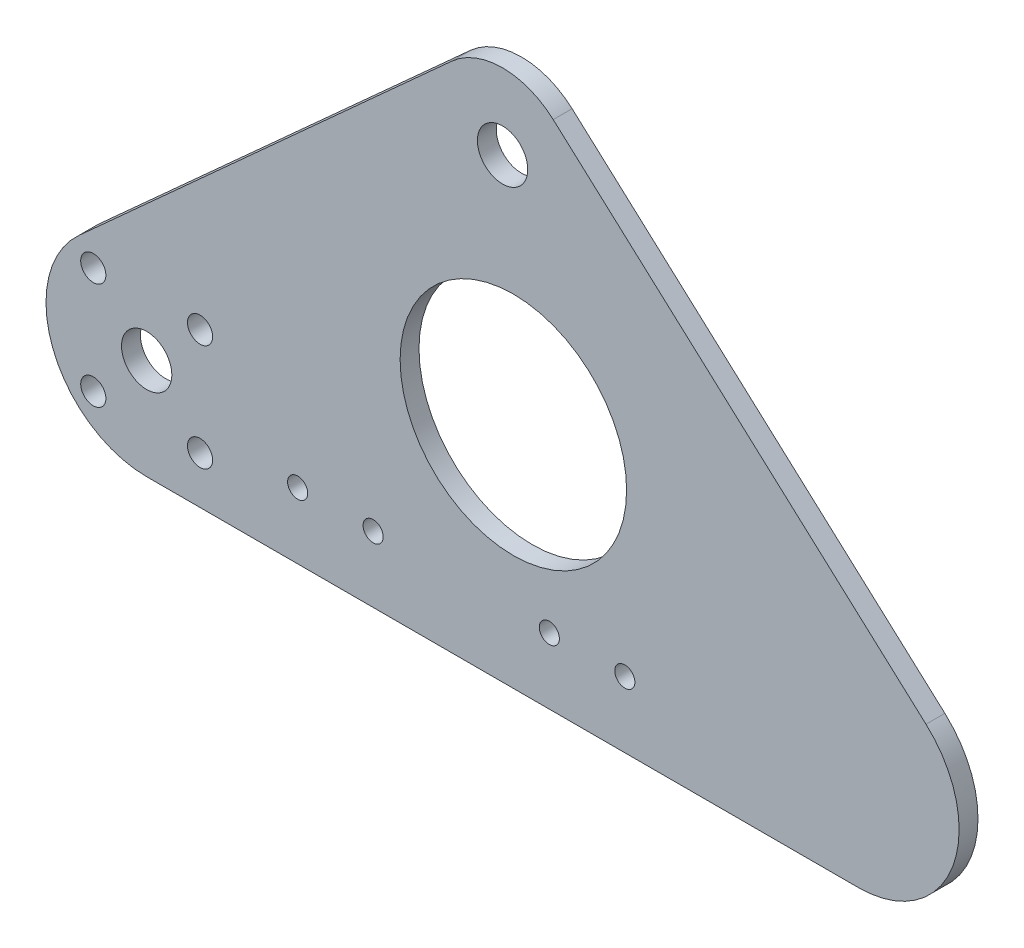
ISO-10303-21;
HEADER;
FILE_DESCRIPTION(('STEP AP214'),'2;1');
FILE_NAME('part.step','',(''),(''),'','','');
FILE_SCHEMA(('AUTOMOTIVE_DESIGN { 1 0 10303 214 1 1 1 1 }'));
ENDSEC;
DATA;
#1=APPLICATION_CONTEXT('core data for automotive mechanical design processes');
#2=APPLICATION_PROTOCOL_DEFINITION('international standard','automotive_design',2000,#1);
#3=PRODUCT_CONTEXT('',#1,'mechanical');
#4=PRODUCT('Part','Part','',(#3));
#5=PRODUCT_RELATED_PRODUCT_CATEGORY('part','',(#4));
#6=PRODUCT_DEFINITION_FORMATION('','',#4);
#7=PRODUCT_DEFINITION_CONTEXT('part definition',#1,'design');
#8=PRODUCT_DEFINITION('design','',#6,#7);
#9=PRODUCT_DEFINITION_SHAPE('','',#8);
#10=(LENGTH_UNIT() NAMED_UNIT(*) SI_UNIT(.MILLI.,.METRE.));
#11=(NAMED_UNIT(*) PLANE_ANGLE_UNIT() SI_UNIT($,.RADIAN.));
#12=(NAMED_UNIT(*) SI_UNIT($,.STERADIAN.) SOLID_ANGLE_UNIT());
#13=UNCERTAINTY_MEASURE_WITH_UNIT(LENGTH_MEASURE(1.E-05),#10,'distance_accuracy_value','');
#14=(GEOMETRIC_REPRESENTATION_CONTEXT(3) GLOBAL_UNCERTAINTY_ASSIGNED_CONTEXT((#13)) GLOBAL_UNIT_ASSIGNED_CONTEXT((#10,
#11,#12)) REPRESENTATION_CONTEXT('',''));
#15=CARTESIAN_POINT('',(0.,0.,0.));
#16=DIRECTION('',(0.,0.,1.));
#17=DIRECTION('',(1.,0.,0.));
#18=AXIS2_PLACEMENT_3D('',#15,#16,#17);
#19=CARTESIAN_POINT('',(-1.71572875252801,36.2842712474748,3.));
#20=DIRECTION('',(0.,0.,1.));
#21=DIRECTION('',(1.,0.,0.));
#22=AXIS2_PLACEMENT_3D('',#19,#20,#21);
#23=PLANE('',#22);
#24=CARTESIAN_POINT('',(-49.7989898732797,-28.7695526217209,3.));
#25=DIRECTION('',(0.,0.,1.));
#26=DIRECTION('',(1.,0.,0.));
#27=AXIS2_PLACEMENT_3D('',#24,#25,#26);
#28=CIRCLE('',#27,2.);
#29=CARTESIAN_POINT('',(-47.7989898732797,-28.7695526217209,3.));
#30=VERTEX_POINT('',#29);
#31=EDGE_CURVE('E217',#30,#30,#28,.T.);
#32=ORIENTED_EDGE('',*,*,#31,.F.);
#33=EDGE_LOOP('',(#32));
#34=FACE_BOUND('',#33,.T.);
#35=CARTESIAN_POINT('',(-66.7695526217568,-11.7989898732438,3.));
#36=DIRECTION('',(0.,0.,1.));
#37=DIRECTION('',(1.,0.,0.));
#38=AXIS2_PLACEMENT_3D('',#35,#36,#37);
#39=CIRCLE('',#38,2.);
#40=CARTESIAN_POINT('',(-64.7695526217568,-11.7989898732438,3.));
#41=VERTEX_POINT('',#40);
#42=EDGE_CURVE('E229',#41,#41,#39,.T.);
#43=ORIENTED_EDGE('',*,*,#42,.F.);
#44=EDGE_LOOP('',(#43));
#45=FACE_BOUND('',#44,.T.);
#46=CARTESIAN_POINT('',(-34.284271247472,-25.784271247471,3.));
#47=DIRECTION('',(0.,0.,1.));
#48=DIRECTION('',(1.,0.,0.));
#49=AXIS2_PLACEMENT_3D('',#46,#47,#48);
#50=CIRCLE('',#49,1.59999999999982);
#51=CARTESIAN_POINT('',(-32.6842712474722,-25.784271247471,3.));
#52=VERTEX_POINT('',#51);
#53=EDGE_CURVE('E241',#52,#52,#50,.T.);
#54=ORIENTED_EDGE('',*,*,#53,.F.);
#55=EDGE_LOOP('',(#54));
#56=FACE_BOUND('',#55,.T.);
#57=CARTESIAN_POINT('',(-1.71572875252801,36.2842712474748,3.));
#58=DIRECTION('',(0.,0.,1.));
#59=DIRECTION('',(1.,0.,0.));
#60=AXIS2_PLACEMENT_3D('',#57,#58,#59);
#61=CIRCLE('',#60,4.);
#62=CARTESIAN_POINT('',(2.28427124747199,36.2842712474748,3.));
#63=VERTEX_POINT('',#62);
#64=EDGE_CURVE('E253',#63,#63,#61,.T.);
#65=ORIENTED_EDGE('',*,*,#64,.F.);
#66=EDGE_LOOP('',(#65));
#67=FACE_BOUND('',#66,.T.);
#68=CARTESIAN_POINT('',(0.,0.,3.));
#69=DIRECTION('',(0.,0.,1.));
#70=DIRECTION('',(1.,0.,0.));
#71=AXIS2_PLACEMENT_3D('',#68,#69,#70);
#72=CIRCLE('',#71,17.9999999999998);
#73=CARTESIAN_POINT('',(17.9999999999998,0.,3.));
#74=VERTEX_POINT('',#73);
#75=EDGE_CURVE('E265',#74,#74,#72,.T.);
#76=ORIENTED_EDGE('',*,*,#75,.F.);
#77=EDGE_LOOP('',(#76));
#78=FACE_BOUND('',#77,.T.);
#79=CARTESIAN_POINT('',(-1.71572875252801,36.2842712474748,3.));
#80=DIRECTION('',(0.,0.,1.));
#81=DIRECTION('',(1.,0.,0.));
#82=AXIS2_PLACEMENT_3D('',#79,#80,#81);
#83=CIRCLE('',#82,12.0000000000314);
#84=CARTESIAN_POINT('',(6.33467531394946,45.1832034512389,3.));
#85=VERTEX_POINT('',#84);
#86=CARTESIAN_POINT('',(-9.7661328189389,45.1832034512999,3.));
#87=VERTEX_POINT('',#86);
#88=EDGE_CURVE('E129',#85,#87,#83,.T.);
#89=ORIENTED_EDGE('',*,*,#88,.T.);
#90=DIRECTION('',(-0.741577683650602,-0.670867005531952,0.));
#91=VECTOR('',#90,1.);
#92=CARTESIAN_POINT('',(-69.0181433359904,-8.41902830902175,3.));
#93=LINE('',#92,#91);
#94=CARTESIAN_POINT('',(-69.01814333599,-8.41902830902226,3.));
#95=VERTEX_POINT('',#94);
#96=EDGE_CURVE('E87',#87,#95,#93,.T.);
#97=ORIENTED_EDGE('',*,*,#96,.T.);
#98=CARTESIAN_POINT('',(-58.2842712475178,-20.2842712474828,3.));
#99=DIRECTION('',(0.,0.,1.));
#100=DIRECTION('',(1.,0.,0.));
#101=AXIS2_PLACEMENT_3D('',#98,#99,#100);
#102=CIRCLE('',#101,16.0000000000116);
#103=CARTESIAN_POINT('',(-58.2842712473575,-36.2842712474937,3.));
#104=VERTEX_POINT('',#103);
#105=EDGE_CURVE('E100',#95,#104,#102,.T.);
#106=ORIENTED_EDGE('',*,*,#105,.T.);
#107=DIRECTION('',(1.,0.,0.));
#108=VECTOR('',#107,1.);
#109=CARTESIAN_POINT('',(-58.2842712473575,-36.2842712474937,3.));
#110=LINE('',#109,#108);
#111=CARTESIAN_POINT('',(54.8528137424922,-36.284271247494,3.));
#112=VERTEX_POINT('',#111);
#113=EDGE_CURVE('E94',#104,#112,#110,.T.);
#114=ORIENTED_EDGE('',*,*,#113,.T.);
#115=CARTESIAN_POINT('',(54.8528137424931,-20.2842712474936,3.));
#116=DIRECTION('',(0.,0.,1.));
#117=DIRECTION('',(1.,0.,0.));
#118=AXIS2_PLACEMENT_3D('',#115,#116,#117);
#119=CIRCLE('',#118,16.0000000000004);
#120=CARTESIAN_POINT('',(65.586685831003,-8.41902830908191,3.));
#121=VERTEX_POINT('',#120);
#122=EDGE_CURVE('E98',#112,#121,#119,.T.);
#123=ORIENTED_EDGE('',*,*,#122,.T.);
#124=DIRECTION('',(-0.741577683650618,0.670867005531934,0.));
#125=VECTOR('',#124,1.);
#126=CARTESIAN_POINT('',(65.586685831003,-8.41902830908191,3.));
#127=LINE('',#126,#125);
#128=EDGE_CURVE('E50',#121,#85,#127,.T.);
#129=ORIENTED_EDGE('',*,*,#128,.T.);
#130=EDGE_LOOP('',(#89,#97,#106,#114,#123,#129));
#131=FACE_BOUND('',#130,.T.);
#132=CARTESIAN_POINT('',(5.71572875252802,-25.7842712474719,3.));
#133=DIRECTION('',(0.,0.,1.));
#134=DIRECTION('',(1.,0.,0.));
#135=AXIS2_PLACEMENT_3D('',#132,#133,#134);
#136=CIRCLE('',#135,1.59999999999982);
#137=CARTESIAN_POINT('',(7.31572875252784,-25.7842712474719,3.));
#138=VERTEX_POINT('',#137);
#139=EDGE_CURVE('E122',#138,#138,#136,.T.);
#140=ORIENTED_EDGE('',*,*,#139,.F.);
#141=EDGE_LOOP('',(#140));
#142=FACE_BOUND('',#141,.T.);
#143=CARTESIAN_POINT('',(-58.2842712475178,-20.2842712474828,3.));
#144=DIRECTION('',(0.,0.,1.));
#145=DIRECTION('',(1.,0.,0.));
#146=AXIS2_PLACEMENT_3D('',#143,#144,#145);
#147=CIRCLE('',#146,3.9999999999738);
#148=CARTESIAN_POINT('',(-54.284271247544,-20.2842712474828,3.));
#149=VERTEX_POINT('',#148);
#150=EDGE_CURVE('E259',#149,#149,#147,.T.);
#151=ORIENTED_EDGE('',*,*,#150,.F.);
#152=EDGE_LOOP('',(#151));
#153=FACE_BOUND('',#152,.T.);
#154=CARTESIAN_POINT('',(-22.2842712474725,-25.7842712474701,3.));
#155=DIRECTION('',(0.,0.,1.));
#156=DIRECTION('',(1.,0.,0.));
#157=AXIS2_PLACEMENT_3D('',#154,#155,#156);
#158=CIRCLE('',#157,1.60000000000027);
#159=CARTESIAN_POINT('',(-20.6842712474722,-25.7842712474701,3.));
#160=VERTEX_POINT('',#159);
#161=EDGE_CURVE('E247',#160,#160,#158,.T.);
#162=ORIENTED_EDGE('',*,*,#161,.F.);
#163=EDGE_LOOP('',(#162));
#164=FACE_BOUND('',#163,.T.);
#165=CARTESIAN_POINT('',(17.7157287525276,-25.7842712474701,3.));
#166=DIRECTION('',(0.,0.,1.));
#167=DIRECTION('',(1.,0.,0.));
#168=AXIS2_PLACEMENT_3D('',#165,#166,#167);
#169=CIRCLE('',#168,1.60000000000027);
#170=CARTESIAN_POINT('',(19.3157287525278,-25.7842712474701,3.));
#171=VERTEX_POINT('',#170);
#172=EDGE_CURVE('E235',#171,#171,#169,.T.);
#173=ORIENTED_EDGE('',*,*,#172,.F.);
#174=EDGE_LOOP('',(#173));
#175=FACE_BOUND('',#174,.T.);
#176=CARTESIAN_POINT('',(-49.7989898732792,-11.7989898732442,3.));
#177=DIRECTION('',(0.,0.,1.));
#178=DIRECTION('',(1.,0.,0.));
#179=AXIS2_PLACEMENT_3D('',#176,#177,#178);
#180=CIRCLE('',#179,2.);
#181=CARTESIAN_POINT('',(-47.7989898732792,-11.7989898732442,3.));
#182=VERTEX_POINT('',#181);
#183=EDGE_CURVE('E223',#182,#182,#180,.T.);
#184=ORIENTED_EDGE('',*,*,#183,.F.);
#185=EDGE_LOOP('',(#184));
#186=FACE_BOUND('',#185,.T.);
#187=CARTESIAN_POINT('',(-66.7695526217564,-28.7695526217213,3.));
#188=DIRECTION('',(0.,0.,1.));
#189=DIRECTION('',(1.,0.,0.));
#190=AXIS2_PLACEMENT_3D('',#187,#188,#189);
#191=CIRCLE('',#190,2.);
#192=CARTESIAN_POINT('',(-64.7695526217564,-28.7695526217213,3.));
#193=VERTEX_POINT('',#192);
#194=EDGE_CURVE('E208',#193,#193,#191,.T.);
#195=ORIENTED_EDGE('',*,*,#194,.F.);
#196=EDGE_LOOP('',(#195));
#197=FACE_BOUND('',#196,.T.);
#198=ADVANCED_FACE('F33',(#34,#45,#56,#67,#78,#131,#142,#153,#164,#175,#186,#197),#23,.T.);
#199=CARTESIAN_POINT('',(-1.71572875252801,36.2842712474748,0.));
#200=DIRECTION('',(0.,0.,1.));
#201=DIRECTION('',(1.,0.,0.));
#202=AXIS2_PLACEMENT_3D('',#199,#200,#201);
#203=PLANE('',#202);
#204=CARTESIAN_POINT('',(-1.71572875252801,36.2842712474748,0.));
#205=DIRECTION('',(0.,0.,1.));
#206=DIRECTION('',(1.,0.,0.));
#207=AXIS2_PLACEMENT_3D('',#204,#205,#206);
#208=CIRCLE('',#207,12.0000000000314);
#209=CARTESIAN_POINT('',(6.33467531394946,45.1832034512389,0.));
#210=VERTEX_POINT('',#209);
#211=CARTESIAN_POINT('',(-9.7661328189389,45.1832034512999,0.));
#212=VERTEX_POINT('',#211);
#213=EDGE_CURVE('E118',#210,#212,#208,.T.);
#214=ORIENTED_EDGE('',*,*,#213,.F.);
#215=DIRECTION('',(-0.741577683650618,0.670867005531934,0.));
#216=VECTOR('',#215,1.);
#217=CARTESIAN_POINT('',(65.586685831003,-8.41902830908191,0.));
#218=LINE('',#217,#216);
#219=CARTESIAN_POINT('',(65.586685831003,-8.41902830908191,0.));
#220=VERTEX_POINT('',#219);
#221=EDGE_CURVE('E79',#220,#210,#218,.T.);
#222=ORIENTED_EDGE('',*,*,#221,.F.);
#223=CARTESIAN_POINT('',(54.8528137424931,-20.2842712474936,0.));
#224=DIRECTION('',(0.,0.,1.));
#225=DIRECTION('',(1.,0.,0.));
#226=AXIS2_PLACEMENT_3D('',#223,#224,#225);
#227=CIRCLE('',#226,16.0000000000004);
#228=CARTESIAN_POINT('',(54.8528137424922,-36.284271247494,0.));
#229=VERTEX_POINT('',#228);
#230=EDGE_CURVE('E73',#229,#220,#227,.T.);
#231=ORIENTED_EDGE('',*,*,#230,.F.);
#232=DIRECTION('',(1.,0.,0.));
#233=VECTOR('',#232,1.);
#234=CARTESIAN_POINT('',(-58.2842712473575,-36.2842712474937,0.));
#235=LINE('',#234,#233);
#236=CARTESIAN_POINT('',(-58.2842712473575,-36.2842712474937,0.));
#237=VERTEX_POINT('',#236);
#238=EDGE_CURVE('E108',#237,#229,#235,.T.);
#239=ORIENTED_EDGE('',*,*,#238,.F.);
#240=CARTESIAN_POINT('',(-58.2842712475178,-20.2842712474828,0.));
#241=DIRECTION('',(0.,0.,1.));
#242=DIRECTION('',(1.,0.,0.));
#243=AXIS2_PLACEMENT_3D('',#240,#241,#242);
#244=CIRCLE('',#243,16.0000000000116);
#245=CARTESIAN_POINT('',(-69.01814333599,-8.41902830902226,0.));
#246=VERTEX_POINT('',#245);
#247=EDGE_CURVE('E124',#246,#237,#244,.T.);
#248=ORIENTED_EDGE('',*,*,#247,.F.);
#249=DIRECTION('',(-0.741577683650602,-0.670867005531952,0.));
#250=VECTOR('',#249,1.);
#251=CARTESIAN_POINT('',(-69.0181433359904,-8.41902830902175,0.));
#252=LINE('',#251,#250);
#253=EDGE_CURVE('E121',#212,#246,#252,.T.);
#254=ORIENTED_EDGE('',*,*,#253,.F.);
#255=EDGE_LOOP('',(#214,#222,#231,#239,#248,#254));
#256=FACE_BOUND('',#255,.T.);
#257=CARTESIAN_POINT('',(5.71572875252802,-25.7842712474719,0.));
#258=DIRECTION('',(0.,0.,1.));
#259=DIRECTION('',(1.,0.,0.));
#260=AXIS2_PLACEMENT_3D('',#257,#258,#259);
#261=CIRCLE('',#260,1.59999999999982);
#262=CARTESIAN_POINT('',(7.31572875252784,-25.7842712474719,0.));
#263=VERTEX_POINT('',#262);
#264=EDGE_CURVE('E268',#263,#263,#261,.T.);
#265=ORIENTED_EDGE('',*,*,#264,.T.);
#266=EDGE_LOOP('',(#265));
#267=FACE_BOUND('',#266,.T.);
#268=CARTESIAN_POINT('',(0.,0.,0.));
#269=DIRECTION('',(0.,0.,1.));
#270=DIRECTION('',(1.,0.,0.));
#271=AXIS2_PLACEMENT_3D('',#268,#269,#270);
#272=CIRCLE('',#271,17.9999999999998);
#273=CARTESIAN_POINT('',(17.9999999999998,0.,0.));
#274=VERTEX_POINT('',#273);
#275=EDGE_CURVE('E262',#274,#274,#272,.T.);
#276=ORIENTED_EDGE('',*,*,#275,.T.);
#277=EDGE_LOOP('',(#276));
#278=FACE_BOUND('',#277,.T.);
#279=CARTESIAN_POINT('',(-58.2842712475178,-20.2842712474828,0.));
#280=DIRECTION('',(0.,0.,1.));
#281=DIRECTION('',(1.,0.,0.));
#282=AXIS2_PLACEMENT_3D('',#279,#280,#281);
#283=CIRCLE('',#282,3.9999999999738);
#284=CARTESIAN_POINT('',(-54.284271247544,-20.2842712474828,0.));
#285=VERTEX_POINT('',#284);
#286=EDGE_CURVE('E256',#285,#285,#283,.T.);
#287=ORIENTED_EDGE('',*,*,#286,.T.);
#288=EDGE_LOOP('',(#287));
#289=FACE_BOUND('',#288,.T.);
#290=CARTESIAN_POINT('',(-1.71572875252801,36.2842712474748,0.));
#291=DIRECTION('',(0.,0.,1.));
#292=DIRECTION('',(1.,0.,0.));
#293=AXIS2_PLACEMENT_3D('',#290,#291,#292);
#294=CIRCLE('',#293,4.);
#295=CARTESIAN_POINT('',(2.28427124747199,36.2842712474748,0.));
#296=VERTEX_POINT('',#295);
#297=EDGE_CURVE('E250',#296,#296,#294,.T.);
#298=ORIENTED_EDGE('',*,*,#297,.T.);
#299=EDGE_LOOP('',(#298));
#300=FACE_BOUND('',#299,.T.);
#301=CARTESIAN_POINT('',(-22.2842712474725,-25.7842712474701,0.));
#302=DIRECTION('',(0.,0.,1.));
#303=DIRECTION('',(1.,0.,0.));
#304=AXIS2_PLACEMENT_3D('',#301,#302,#303);
#305=CIRCLE('',#304,1.60000000000027);
#306=CARTESIAN_POINT('',(-20.6842712474722,-25.7842712474701,0.));
#307=VERTEX_POINT('',#306);
#308=EDGE_CURVE('E244',#307,#307,#305,.T.);
#309=ORIENTED_EDGE('',*,*,#308,.T.);
#310=EDGE_LOOP('',(#309));
#311=FACE_BOUND('',#310,.T.);
#312=CARTESIAN_POINT('',(-34.284271247472,-25.784271247471,0.));
#313=DIRECTION('',(0.,0.,1.));
#314=DIRECTION('',(1.,0.,0.));
#315=AXIS2_PLACEMENT_3D('',#312,#313,#314);
#316=CIRCLE('',#315,1.59999999999982);
#317=CARTESIAN_POINT('',(-32.6842712474722,-25.784271247471,0.));
#318=VERTEX_POINT('',#317);
#319=EDGE_CURVE('E238',#318,#318,#316,.T.);
#320=ORIENTED_EDGE('',*,*,#319,.T.);
#321=EDGE_LOOP('',(#320));
#322=FACE_BOUND('',#321,.T.);
#323=CARTESIAN_POINT('',(17.7157287525276,-25.7842712474701,0.));
#324=DIRECTION('',(0.,0.,1.));
#325=DIRECTION('',(1.,0.,0.));
#326=AXIS2_PLACEMENT_3D('',#323,#324,#325);
#327=CIRCLE('',#326,1.60000000000027);
#328=CARTESIAN_POINT('',(19.3157287525278,-25.7842712474701,0.));
#329=VERTEX_POINT('',#328);
#330=EDGE_CURVE('E232',#329,#329,#327,.T.);
#331=ORIENTED_EDGE('',*,*,#330,.T.);
#332=EDGE_LOOP('',(#331));
#333=FACE_BOUND('',#332,.T.);
#334=CARTESIAN_POINT('',(-66.7695526217568,-11.7989898732438,0.));
#335=DIRECTION('',(0.,0.,1.));
#336=DIRECTION('',(1.,0.,0.));
#337=AXIS2_PLACEMENT_3D('',#334,#335,#336);
#338=CIRCLE('',#337,2.);
#339=CARTESIAN_POINT('',(-64.7695526217568,-11.7989898732438,0.));
#340=VERTEX_POINT('',#339);
#341=EDGE_CURVE('E226',#340,#340,#338,.T.);
#342=ORIENTED_EDGE('',*,*,#341,.T.);
#343=EDGE_LOOP('',(#342));
#344=FACE_BOUND('',#343,.T.);
#345=CARTESIAN_POINT('',(-49.7989898732792,-11.7989898732442,0.));
#346=DIRECTION('',(0.,0.,1.));
#347=DIRECTION('',(1.,0.,0.));
#348=AXIS2_PLACEMENT_3D('',#345,#346,#347);
#349=CIRCLE('',#348,2.);
#350=CARTESIAN_POINT('',(-47.7989898732792,-11.7989898732442,0.));
#351=VERTEX_POINT('',#350);
#352=EDGE_CURVE('E220',#351,#351,#349,.T.);
#353=ORIENTED_EDGE('',*,*,#352,.T.);
#354=EDGE_LOOP('',(#353));
#355=FACE_BOUND('',#354,.T.);
#356=CARTESIAN_POINT('',(-49.7989898732797,-28.7695526217209,0.));
#357=DIRECTION('',(0.,0.,1.));
#358=DIRECTION('',(1.,0.,0.));
#359=AXIS2_PLACEMENT_3D('',#356,#357,#358);
#360=CIRCLE('',#359,2.);
#361=CARTESIAN_POINT('',(-47.7989898732797,-28.7695526217209,0.));
#362=VERTEX_POINT('',#361);
#363=EDGE_CURVE('E214',#362,#362,#360,.T.);
#364=ORIENTED_EDGE('',*,*,#363,.T.);
#365=EDGE_LOOP('',(#364));
#366=FACE_BOUND('',#365,.T.);
#367=CARTESIAN_POINT('',(-66.7695526217564,-28.7695526217213,0.));
#368=DIRECTION('',(0.,0.,1.));
#369=DIRECTION('',(1.,0.,0.));
#370=AXIS2_PLACEMENT_3D('',#367,#368,#369);
#371=CIRCLE('',#370,2.);
#372=CARTESIAN_POINT('',(-64.7695526217564,-28.7695526217213,0.));
#373=VERTEX_POINT('',#372);
#374=EDGE_CURVE('E211',#373,#373,#371,.T.);
#375=ORIENTED_EDGE('',*,*,#374,.T.);
#376=EDGE_LOOP('',(#375));
#377=FACE_BOUND('',#376,.T.);
#378=ADVANCED_FACE('F138',(#256,#267,#278,#289,#300,#311,#322,#333,#344,#355,#366,#377),#203,.F.);
#379=CARTESIAN_POINT('',(-1.71572875252801,36.2842712474748,3.));
#380=DIRECTION('',(0.,0.,-1.));
#381=DIRECTION('',(-1.,0.,0.));
#382=AXIS2_PLACEMENT_3D('',#379,#380,#381);
#383=CYLINDRICAL_SURFACE('',#382,12.0000000000314);
#384=ORIENTED_EDGE('',*,*,#213,.T.);
#385=DIRECTION('',(0.,0.,-1.));
#386=VECTOR('',#385,1.);
#387=CARTESIAN_POINT('',(-9.7661328189389,45.1832034512999,3.));
#388=LINE('',#387,#386);
#389=EDGE_CURVE('E11',#87,#212,#388,.T.);
#390=ORIENTED_EDGE('',*,*,#389,.F.);
#391=ORIENTED_EDGE('',*,*,#88,.F.);
#392=DIRECTION('',(0.,0.,-1.));
#393=VECTOR('',#392,1.);
#394=CARTESIAN_POINT('',(6.33467531394946,45.1832034512389,3.));
#395=LINE('',#394,#393);
#396=EDGE_CURVE('E114',#85,#210,#395,.T.);
#397=ORIENTED_EDGE('',*,*,#396,.T.);
#398=EDGE_LOOP('',(#384,#390,#391,#397));
#399=FACE_BOUND('',#398,.T.);
#400=ADVANCED_FACE('F35',(#399),#383,.T.);
#401=CARTESIAN_POINT('',(-69.0181433359904,-8.41902830902175,3.));
#402=DIRECTION('',(0.670867005531952,-0.741577683650602,0.));
#403=DIRECTION('',(0.741577683650602,0.670867005531952,0.));
#404=AXIS2_PLACEMENT_3D('',#401,#402,#403);
#405=PLANE('',#404);
#406=ORIENTED_EDGE('',*,*,#253,.T.);
#407=DIRECTION('',(0.,0.,-1.));
#408=VECTOR('',#407,1.);
#409=CARTESIAN_POINT('',(-69.01814333599,-8.41902830902226,3.));
#410=LINE('',#409,#408);
#411=EDGE_CURVE('E42',#95,#246,#410,.T.);
#412=ORIENTED_EDGE('',*,*,#411,.F.);
#413=ORIENTED_EDGE('',*,*,#96,.F.);
#414=ORIENTED_EDGE('',*,*,#389,.T.);
#415=EDGE_LOOP('',(#406,#412,#413,#414));
#416=FACE_BOUND('',#415,.T.);
#417=ADVANCED_FACE('F389',(#416),#405,.F.);
#418=CARTESIAN_POINT('',(-58.2842712475178,-20.2842712474828,3.));
#419=DIRECTION('',(0.,0.,-1.));
#420=DIRECTION('',(-1.,0.,0.));
#421=AXIS2_PLACEMENT_3D('',#418,#419,#420);
#422=CYLINDRICAL_SURFACE('',#421,16.0000000000116);
#423=ORIENTED_EDGE('',*,*,#247,.T.);
#424=DIRECTION('',(0.,0.,-1.));
#425=VECTOR('',#424,1.);
#426=CARTESIAN_POINT('',(-58.2842712473575,-36.2842712474937,3.));
#427=LINE('',#426,#425);
#428=EDGE_CURVE('E109',#104,#237,#427,.T.);
#429=ORIENTED_EDGE('',*,*,#428,.F.);
#430=ORIENTED_EDGE('',*,*,#105,.F.);
#431=ORIENTED_EDGE('',*,*,#411,.T.);
#432=EDGE_LOOP('',(#423,#429,#430,#431));
#433=FACE_BOUND('',#432,.T.);
#434=ADVANCED_FACE('F135',(#433),#422,.T.);
#435=CARTESIAN_POINT('',(-58.2842712473575,-36.2842712474937,3.));
#436=DIRECTION('',(0.,1.,0.));
#437=DIRECTION('',(0.,0.,1.));
#438=AXIS2_PLACEMENT_3D('',#435,#436,#437);
#439=PLANE('',#438);
#440=ORIENTED_EDGE('',*,*,#238,.T.);
#441=DIRECTION('',(0.,0.,-1.));
#442=VECTOR('',#441,1.);
#443=CARTESIAN_POINT('',(54.8528137424922,-36.284271247494,3.));
#444=LINE('',#443,#442);
#445=EDGE_CURVE('E105',#112,#229,#444,.T.);
#446=ORIENTED_EDGE('',*,*,#445,.F.);
#447=ORIENTED_EDGE('',*,*,#113,.F.);
#448=ORIENTED_EDGE('',*,*,#428,.T.);
#449=EDGE_LOOP('',(#440,#446,#447,#448));
#450=FACE_BOUND('',#449,.T.);
#451=ADVANCED_FACE('F106',(#450),#439,.F.);
#452=CARTESIAN_POINT('',(54.8528137424931,-20.2842712474936,3.));
#453=DIRECTION('',(0.,0.,-1.));
#454=DIRECTION('',(-1.,0.,0.));
#455=AXIS2_PLACEMENT_3D('',#452,#453,#454);
#456=CYLINDRICAL_SURFACE('',#455,16.0000000000004);
#457=ORIENTED_EDGE('',*,*,#230,.T.);
#458=DIRECTION('',(0.,0.,-1.));
#459=VECTOR('',#458,1.);
#460=CARTESIAN_POINT('',(65.586685831003,-8.41902830908191,3.));
#461=LINE('',#460,#459);
#462=EDGE_CURVE('E110',#121,#220,#461,.T.);
#463=ORIENTED_EDGE('',*,*,#462,.F.);
#464=ORIENTED_EDGE('',*,*,#122,.F.);
#465=ORIENTED_EDGE('',*,*,#445,.T.);
#466=EDGE_LOOP('',(#457,#463,#464,#465));
#467=FACE_BOUND('',#466,.T.);
#468=ADVANCED_FACE('F112',(#467),#456,.T.);
#469=CARTESIAN_POINT('',(65.586685831003,-8.41902830908191,3.));
#470=DIRECTION('',(-0.670867005531933,-0.741577683650618,0.));
#471=DIRECTION('',(0.741577683650618,-0.670867005531934,0.));
#472=AXIS2_PLACEMENT_3D('',#469,#470,#471);
#473=PLANE('',#472);
#474=ORIENTED_EDGE('',*,*,#221,.T.);
#475=ORIENTED_EDGE('',*,*,#396,.F.);
#476=ORIENTED_EDGE('',*,*,#128,.F.);
#477=ORIENTED_EDGE('',*,*,#462,.T.);
#478=EDGE_LOOP('',(#474,#475,#476,#477));
#479=FACE_BOUND('',#478,.T.);
#480=ADVANCED_FACE('F143',(#479),#473,.F.);
#481=CARTESIAN_POINT('',(5.71572875252802,-25.7842712474719,3.));
#482=DIRECTION('',(0.,0.,-1.));
#483=DIRECTION('',(-1.,0.,0.));
#484=AXIS2_PLACEMENT_3D('',#481,#482,#483);
#485=CYLINDRICAL_SURFACE('',#484,1.59999999999982);
#486=ORIENTED_EDGE('',*,*,#139,.T.);
#487=EDGE_LOOP('',(#486));
#488=FACE_BOUND('',#487,.T.);
#489=ORIENTED_EDGE('',*,*,#264,.F.);
#490=EDGE_LOOP('',(#489));
#491=FACE_BOUND('',#490,.T.);
#492=ADVANCED_FACE('F145',(#488,#491),#485,.F.);
#493=CARTESIAN_POINT('',(0.,0.,3.));
#494=DIRECTION('',(0.,0.,-1.));
#495=DIRECTION('',(-1.,0.,0.));
#496=AXIS2_PLACEMENT_3D('',#493,#494,#495);
#497=CYLINDRICAL_SURFACE('',#496,17.9999999999998);
#498=ORIENTED_EDGE('',*,*,#75,.T.);
#499=EDGE_LOOP('',(#498));
#500=FACE_BOUND('',#499,.T.);
#501=ORIENTED_EDGE('',*,*,#275,.F.);
#502=EDGE_LOOP('',(#501));
#503=FACE_BOUND('',#502,.T.);
#504=ADVANCED_FACE('F151',(#500,#503),#497,.F.);
#505=CARTESIAN_POINT('',(-58.2842712475178,-20.2842712474828,3.));
#506=DIRECTION('',(0.,0.,-1.));
#507=DIRECTION('',(-1.,0.,0.));
#508=AXIS2_PLACEMENT_3D('',#505,#506,#507);
#509=CYLINDRICAL_SURFACE('',#508,3.9999999999738);
#510=ORIENTED_EDGE('',*,*,#150,.T.);
#511=EDGE_LOOP('',(#510));
#512=FACE_BOUND('',#511,.T.);
#513=ORIENTED_EDGE('',*,*,#286,.F.);
#514=EDGE_LOOP('',(#513));
#515=FACE_BOUND('',#514,.T.);
#516=ADVANCED_FACE('F167',(#512,#515),#509,.F.);
#517=CARTESIAN_POINT('',(-1.71572875252801,36.2842712474748,3.));
#518=DIRECTION('',(0.,0.,-1.));
#519=DIRECTION('',(-1.,0.,0.));
#520=AXIS2_PLACEMENT_3D('',#517,#518,#519);
#521=CYLINDRICAL_SURFACE('',#520,4.);
#522=ORIENTED_EDGE('',*,*,#64,.T.);
#523=EDGE_LOOP('',(#522));
#524=FACE_BOUND('',#523,.T.);
#525=ORIENTED_EDGE('',*,*,#297,.F.);
#526=EDGE_LOOP('',(#525));
#527=FACE_BOUND('',#526,.T.);
#528=ADVANCED_FACE('F171',(#524,#527),#521,.F.);
#529=CARTESIAN_POINT('',(-22.2842712474725,-25.7842712474701,3.));
#530=DIRECTION('',(0.,0.,-1.));
#531=DIRECTION('',(-1.,0.,0.));
#532=AXIS2_PLACEMENT_3D('',#529,#530,#531);
#533=CYLINDRICAL_SURFACE('',#532,1.60000000000027);
#534=ORIENTED_EDGE('',*,*,#161,.T.);
#535=EDGE_LOOP('',(#534));
#536=FACE_BOUND('',#535,.T.);
#537=ORIENTED_EDGE('',*,*,#308,.F.);
#538=EDGE_LOOP('',(#537));
#539=FACE_BOUND('',#538,.T.);
#540=ADVANCED_FACE('F175',(#536,#539),#533,.F.);
#541=CARTESIAN_POINT('',(-34.284271247472,-25.784271247471,3.));
#542=DIRECTION('',(0.,0.,-1.));
#543=DIRECTION('',(-1.,0.,0.));
#544=AXIS2_PLACEMENT_3D('',#541,#542,#543);
#545=CYLINDRICAL_SURFACE('',#544,1.59999999999982);
#546=ORIENTED_EDGE('',*,*,#53,.T.);
#547=EDGE_LOOP('',(#546));
#548=FACE_BOUND('',#547,.T.);
#549=ORIENTED_EDGE('',*,*,#319,.F.);
#550=EDGE_LOOP('',(#549));
#551=FACE_BOUND('',#550,.T.);
#552=ADVANCED_FACE('F179',(#548,#551),#545,.F.);
#553=CARTESIAN_POINT('',(17.7157287525276,-25.7842712474701,3.));
#554=DIRECTION('',(0.,0.,-1.));
#555=DIRECTION('',(-1.,0.,0.));
#556=AXIS2_PLACEMENT_3D('',#553,#554,#555);
#557=CYLINDRICAL_SURFACE('',#556,1.60000000000027);
#558=ORIENTED_EDGE('',*,*,#172,.T.);
#559=EDGE_LOOP('',(#558));
#560=FACE_BOUND('',#559,.T.);
#561=ORIENTED_EDGE('',*,*,#330,.F.);
#562=EDGE_LOOP('',(#561));
#563=FACE_BOUND('',#562,.T.);
#564=ADVANCED_FACE('F183',(#560,#563),#557,.F.);
#565=CARTESIAN_POINT('',(-66.7695526217568,-11.7989898732438,3.));
#566=DIRECTION('',(0.,0.,-1.));
#567=DIRECTION('',(-1.,0.,0.));
#568=AXIS2_PLACEMENT_3D('',#565,#566,#567);
#569=CYLINDRICAL_SURFACE('',#568,2.);
#570=ORIENTED_EDGE('',*,*,#42,.T.);
#571=EDGE_LOOP('',(#570));
#572=FACE_BOUND('',#571,.T.);
#573=ORIENTED_EDGE('',*,*,#341,.F.);
#574=EDGE_LOOP('',(#573));
#575=FACE_BOUND('',#574,.T.);
#576=ADVANCED_FACE('F187',(#572,#575),#569,.F.);
#577=CARTESIAN_POINT('',(-49.7989898732792,-11.7989898732442,3.));
#578=DIRECTION('',(0.,0.,-1.));
#579=DIRECTION('',(-1.,0.,0.));
#580=AXIS2_PLACEMENT_3D('',#577,#578,#579);
#581=CYLINDRICAL_SURFACE('',#580,2.);
#582=ORIENTED_EDGE('',*,*,#183,.T.);
#583=EDGE_LOOP('',(#582));
#584=FACE_BOUND('',#583,.T.);
#585=ORIENTED_EDGE('',*,*,#352,.F.);
#586=EDGE_LOOP('',(#585));
#587=FACE_BOUND('',#586,.T.);
#588=ADVANCED_FACE('F191',(#584,#587),#581,.F.);
#589=CARTESIAN_POINT('',(-49.7989898732797,-28.7695526217209,3.));
#590=DIRECTION('',(0.,0.,-1.));
#591=DIRECTION('',(-1.,0.,0.));
#592=AXIS2_PLACEMENT_3D('',#589,#590,#591);
#593=CYLINDRICAL_SURFACE('',#592,2.);
#594=ORIENTED_EDGE('',*,*,#31,.T.);
#595=EDGE_LOOP('',(#594));
#596=FACE_BOUND('',#595,.T.);
#597=ORIENTED_EDGE('',*,*,#363,.F.);
#598=EDGE_LOOP('',(#597));
#599=FACE_BOUND('',#598,.T.);
#600=ADVANCED_FACE('F195',(#596,#599),#593,.F.);
#601=CARTESIAN_POINT('',(-66.7695526217564,-28.7695526217213,3.));
#602=DIRECTION('',(0.,0.,-1.));
#603=DIRECTION('',(-1.,0.,0.));
#604=AXIS2_PLACEMENT_3D('',#601,#602,#603);
#605=CYLINDRICAL_SURFACE('',#604,2.);
#606=ORIENTED_EDGE('',*,*,#194,.T.);
#607=EDGE_LOOP('',(#606));
#608=FACE_BOUND('',#607,.T.);
#609=ORIENTED_EDGE('',*,*,#374,.F.);
#610=EDGE_LOOP('',(#609));
#611=FACE_BOUND('',#610,.T.);
#612=ADVANCED_FACE('F199',(#608,#611),#605,.F.);
#613=CLOSED_SHELL('',(#198,#378,#400,#417,#434,#451,#468,#480,#492,#504,#516,#528,#540,#552,
#564,#576,#588,#600,#612));
#614=MANIFOLD_SOLID_BREP('B2',#613);
#615=ADVANCED_BREP_SHAPE_REPRESENTATION('',(#18,#614),#14);
#616=SHAPE_DEFINITION_REPRESENTATION(#9,#615);
ENDSEC;
END-ISO-10303-21;
